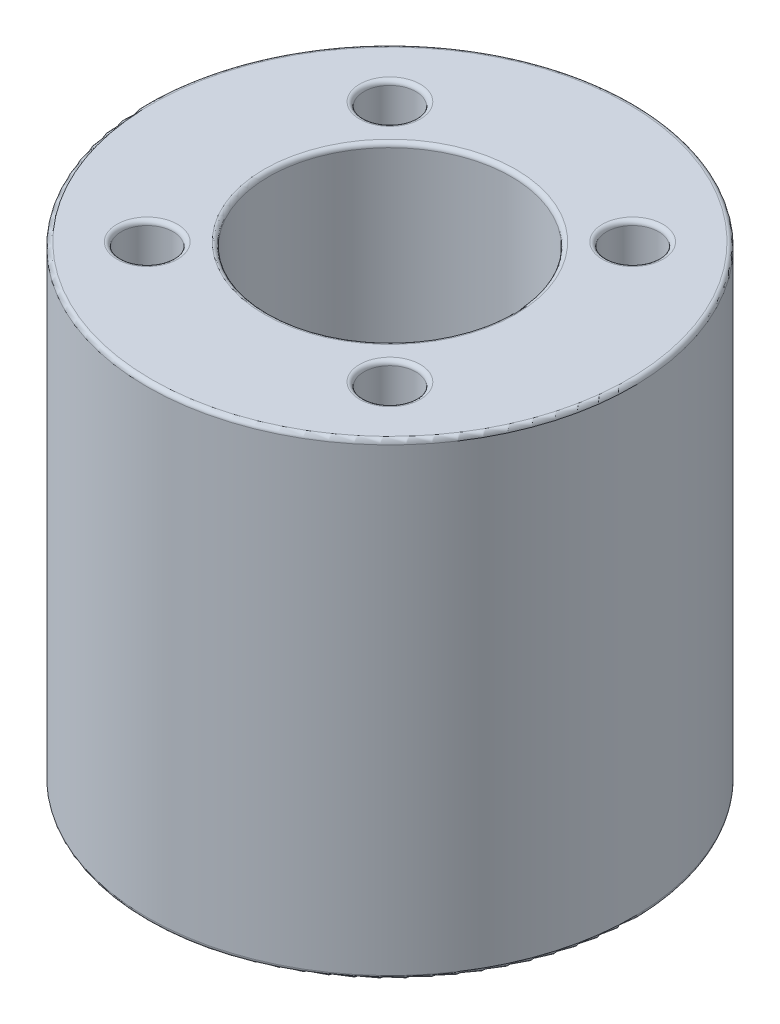
ISO-10303-21;
HEADER;
FILE_DESCRIPTION(('STEP AP214'),'2;1');
FILE_NAME('part.step','',(''),(''),'','','');
FILE_SCHEMA(('AUTOMOTIVE_DESIGN { 1 0 10303 214 1 1 1 1 }'));
ENDSEC;
DATA;
#1=APPLICATION_CONTEXT('core data for automotive mechanical design processes');
#2=APPLICATION_PROTOCOL_DEFINITION('international standard','automotive_design',2000,#1);
#3=PRODUCT_CONTEXT('',#1,'mechanical');
#4=PRODUCT('Part','Part','',(#3));
#5=PRODUCT_RELATED_PRODUCT_CATEGORY('part','',(#4));
#6=PRODUCT_DEFINITION_FORMATION('','',#4);
#7=PRODUCT_DEFINITION_CONTEXT('part definition',#1,'design');
#8=PRODUCT_DEFINITION('design','',#6,#7);
#9=PRODUCT_DEFINITION_SHAPE('','',#8);
#10=(LENGTH_UNIT() NAMED_UNIT(*) SI_UNIT(.MILLI.,.METRE.));
#11=(NAMED_UNIT(*) PLANE_ANGLE_UNIT() SI_UNIT($,.RADIAN.));
#12=(NAMED_UNIT(*) SI_UNIT($,.STERADIAN.) SOLID_ANGLE_UNIT());
#13=UNCERTAINTY_MEASURE_WITH_UNIT(LENGTH_MEASURE(1.E-05),#10,'distance_accuracy_value','');
#14=(GEOMETRIC_REPRESENTATION_CONTEXT(3) GLOBAL_UNCERTAINTY_ASSIGNED_CONTEXT((#13)) GLOBAL_UNIT_ASSIGNED_CONTEXT((#10,
#11,#12)) REPRESENTATION_CONTEXT('',''));
#15=CARTESIAN_POINT('',(0.,0.,0.));
#16=DIRECTION('',(0.,0.,1.));
#17=DIRECTION('',(1.,0.,0.));
#18=AXIS2_PLACEMENT_3D('',#15,#16,#17);
#19=CARTESIAN_POINT('',(0.,0.,0.));
#20=DIRECTION('',(0.,1.,0.));
#21=DIRECTION('',(0.,0.,1.));
#22=AXIS2_PLACEMENT_3D('',#19,#20,#21);
#23=CYLINDRICAL_SURFACE('',#22,4.);
#24=CARTESIAN_POINT('',(0.,14.75,0.));
#25=DIRECTION('',(0.,1.,0.));
#26=DIRECTION('',(0.,0.,1.));
#27=AXIS2_PLACEMENT_3D('',#24,#25,#26);
#28=CIRCLE('',#27,4.);
#29=CARTESIAN_POINT('',(0.,14.75,4.));
#30=VERTEX_POINT('',#29);
#31=EDGE_CURVE('E93',#30,#30,#28,.T.);
#32=ORIENTED_EDGE('',*,*,#31,.T.);
#33=EDGE_LOOP('',(#32));
#34=FACE_BOUND('',#33,.T.);
#35=CARTESIAN_POINT('',(0.,0.25,0.));
#36=DIRECTION('',(0.,1.,0.));
#37=DIRECTION('',(0.,0.,1.));
#38=AXIS2_PLACEMENT_3D('',#35,#36,#37);
#39=CIRCLE('',#38,4.);
#40=CARTESIAN_POINT('',(0.,0.25,4.));
#41=VERTEX_POINT('',#40);
#42=EDGE_CURVE('E96',#41,#41,#39,.F.);
#43=ORIENTED_EDGE('',*,*,#42,.T.);
#44=EDGE_LOOP('',(#43));
#45=FACE_BOUND('',#44,.T.);
#46=ADVANCED_FACE('F37',(#34,#45),#23,.F.);
#47=CARTESIAN_POINT('',(0.,27.,0.));
#48=DIRECTION('',(0.,-1.,0.));
#49=DIRECTION('',(0.,0.,-1.));
#50=AXIS2_PLACEMENT_3D('',#47,#48,#49);
#51=CYLINDRICAL_SURFACE('',#50,14.);
#52=CARTESIAN_POINT('',(0.,0.25,0.));
#53=DIRECTION('',(0.,1.,0.));
#54=DIRECTION('',(0.,0.,1.));
#55=AXIS2_PLACEMENT_3D('',#52,#53,#54);
#56=CIRCLE('',#55,14.);
#57=CARTESIAN_POINT('',(0.,0.25,14.));
#58=VERTEX_POINT('',#57);
#59=EDGE_CURVE('E111',#58,#58,#56,.T.);
#60=ORIENTED_EDGE('',*,*,#59,.T.);
#61=EDGE_LOOP('',(#60));
#62=FACE_BOUND('',#61,.T.);
#63=CARTESIAN_POINT('',(0.,26.75,0.));
#64=DIRECTION('',(0.,1.,0.));
#65=DIRECTION('',(0.,0.,1.));
#66=AXIS2_PLACEMENT_3D('',#63,#64,#65);
#67=CIRCLE('',#66,14.);
#68=CARTESIAN_POINT('',(0.,26.75,14.));
#69=VERTEX_POINT('',#68);
#70=EDGE_CURVE('E114',#69,#69,#67,.F.);
#71=ORIENTED_EDGE('',*,*,#70,.T.);
#72=EDGE_LOOP('',(#71));
#73=FACE_BOUND('',#72,.T.);
#74=ADVANCED_FACE('F159',(#62,#73),#51,.T.);
#75=CARTESIAN_POINT('',(0.,27.,0.));
#76=DIRECTION('',(0.,1.,0.));
#77=DIRECTION('',(0.,0.,1.));
#78=AXIS2_PLACEMENT_3D('',#75,#76,#77);
#79=PLANE('',#78);
#80=CARTESIAN_POINT('',(7.,27.,-7.));
#81=DIRECTION('',(0.,1.,0.));
#82=DIRECTION('',(0.,0.,1.));
#83=AXIS2_PLACEMENT_3D('',#80,#81,#82);
#84=CIRCLE('',#83,1.75);
#85=CARTESIAN_POINT('',(7.,27.,-5.25));
#86=VERTEX_POINT('',#85);
#87=EDGE_CURVE('E10',#86,#86,#84,.F.);
#88=ORIENTED_EDGE('',*,*,#87,.T.);
#89=EDGE_LOOP('',(#88));
#90=FACE_BOUND('',#89,.T.);
#91=CARTESIAN_POINT('',(7.,27.,7.));
#92=DIRECTION('',(0.,1.,0.));
#93=DIRECTION('',(0.,0.,1.));
#94=AXIS2_PLACEMENT_3D('',#91,#92,#93);
#95=CIRCLE('',#94,1.75);
#96=CARTESIAN_POINT('',(7.,27.,8.75));
#97=VERTEX_POINT('',#96);
#98=EDGE_CURVE('E44',#97,#97,#95,.F.);
#99=ORIENTED_EDGE('',*,*,#98,.T.);
#100=EDGE_LOOP('',(#99));
#101=FACE_BOUND('',#100,.T.);
#102=CARTESIAN_POINT('',(-7.,27.,7.));
#103=DIRECTION('',(0.,1.,0.));
#104=DIRECTION('',(0.,0.,1.));
#105=AXIS2_PLACEMENT_3D('',#102,#103,#104);
#106=CIRCLE('',#105,1.75);
#107=CARTESIAN_POINT('',(-7.,27.,8.75));
#108=VERTEX_POINT('',#107);
#109=EDGE_CURVE('E48',#108,#108,#106,.F.);
#110=ORIENTED_EDGE('',*,*,#109,.T.);
#111=EDGE_LOOP('',(#110));
#112=FACE_BOUND('',#111,.T.);
#113=CARTESIAN_POINT('',(-7.,27.,-7.));
#114=DIRECTION('',(0.,1.,0.));
#115=DIRECTION('',(0.,0.,1.));
#116=AXIS2_PLACEMENT_3D('',#113,#114,#115);
#117=CIRCLE('',#116,1.75);
#118=CARTESIAN_POINT('',(-7.,27.,-5.25));
#119=VERTEX_POINT('',#118);
#120=EDGE_CURVE('E52',#119,#119,#117,.F.);
#121=ORIENTED_EDGE('',*,*,#120,.T.);
#122=EDGE_LOOP('',(#121));
#123=FACE_BOUND('',#122,.T.);
#124=CARTESIAN_POINT('',(0.,27.,0.));
#125=DIRECTION('',(0.,1.,0.));
#126=DIRECTION('',(0.,0.,1.));
#127=AXIS2_PLACEMENT_3D('',#124,#125,#126);
#128=CIRCLE('',#127,7.25);
#129=CARTESIAN_POINT('',(0.,27.,7.25));
#130=VERTEX_POINT('',#129);
#131=EDGE_CURVE('E117',#130,#130,#128,.F.);
#132=ORIENTED_EDGE('',*,*,#131,.T.);
#133=EDGE_LOOP('',(#132));
#134=FACE_BOUND('',#133,.T.);
#135=CARTESIAN_POINT('',(0.,27.,0.));
#136=DIRECTION('',(0.,1.,0.));
#137=DIRECTION('',(0.,0.,1.));
#138=AXIS2_PLACEMENT_3D('',#135,#136,#137);
#139=CIRCLE('',#138,13.75);
#140=CARTESIAN_POINT('',(0.,27.,13.75));
#141=VERTEX_POINT('',#140);
#142=EDGE_CURVE('E120',#141,#141,#139,.T.);
#143=ORIENTED_EDGE('',*,*,#142,.T.);
#144=EDGE_LOOP('',(#143));
#145=FACE_BOUND('',#144,.T.);
#146=ADVANCED_FACE('F165',(#90,#101,#112,#123,#134,#145),#79,.T.);
#147=CARTESIAN_POINT('',(0.,0.,0.));
#148=DIRECTION('',(0.,1.,0.));
#149=DIRECTION('',(0.,0.,1.));
#150=AXIS2_PLACEMENT_3D('',#147,#148,#149);
#151=PLANE('',#150);
#152=CARTESIAN_POINT('',(0.,0.,0.));
#153=DIRECTION('',(0.,1.,0.));
#154=DIRECTION('',(0.,0.,1.));
#155=AXIS2_PLACEMENT_3D('',#152,#153,#154);
#156=CIRCLE('',#155,13.75);
#157=CARTESIAN_POINT('',(0.,0.,13.75));
#158=VERTEX_POINT('',#157);
#159=EDGE_CURVE('E105',#158,#158,#156,.F.);
#160=ORIENTED_EDGE('',*,*,#159,.T.);
#161=EDGE_LOOP('',(#160));
#162=FACE_BOUND('',#161,.T.);
#163=CARTESIAN_POINT('',(0.,0.,0.));
#164=DIRECTION('',(0.,1.,0.));
#165=DIRECTION('',(0.,0.,1.));
#166=AXIS2_PLACEMENT_3D('',#163,#164,#165);
#167=CIRCLE('',#166,4.25);
#168=CARTESIAN_POINT('',(0.,0.,4.25));
#169=VERTEX_POINT('',#168);
#170=EDGE_CURVE('E108',#169,#169,#167,.T.);
#171=ORIENTED_EDGE('',*,*,#170,.T.);
#172=EDGE_LOOP('',(#171));
#173=FACE_BOUND('',#172,.T.);
#174=ADVANCED_FACE('F143',(#162,#173),#151,.F.);
#175=CARTESIAN_POINT('',(0.,15.,0.));
#176=DIRECTION('',(0.,1.,0.));
#177=DIRECTION('',(0.,0.,1.));
#178=AXIS2_PLACEMENT_3D('',#175,#176,#177);
#179=PLANE('',#178);
#180=CARTESIAN_POINT('',(0.,15.,0.));
#181=DIRECTION('',(0.,1.,0.));
#182=DIRECTION('',(0.,0.,1.));
#183=AXIS2_PLACEMENT_3D('',#180,#181,#182);
#184=CIRCLE('',#183,6.75);
#185=CARTESIAN_POINT('',(0.,15.,6.75));
#186=VERTEX_POINT('',#185);
#187=EDGE_CURVE('E99',#186,#186,#184,.T.);
#188=ORIENTED_EDGE('',*,*,#187,.T.);
#189=EDGE_LOOP('',(#188));
#190=FACE_BOUND('',#189,.T.);
#191=CARTESIAN_POINT('',(0.,15.,0.));
#192=DIRECTION('',(0.,1.,0.));
#193=DIRECTION('',(0.,0.,1.));
#194=AXIS2_PLACEMENT_3D('',#191,#192,#193);
#195=CIRCLE('',#194,4.25);
#196=CARTESIAN_POINT('',(0.,15.,4.25));
#197=VERTEX_POINT('',#196);
#198=EDGE_CURVE('E102',#197,#197,#195,.F.);
#199=ORIENTED_EDGE('',*,*,#198,.T.);
#200=EDGE_LOOP('',(#199));
#201=FACE_BOUND('',#200,.T.);
#202=ADVANCED_FACE('F140',(#190,#201),#179,.T.);
#203=CARTESIAN_POINT('',(0.,15.,0.));
#204=DIRECTION('',(0.,1.,0.));
#205=DIRECTION('',(0.,0.,1.));
#206=AXIS2_PLACEMENT_3D('',#203,#204,#205);
#207=CYLINDRICAL_SURFACE('',#206,7.);
#208=CARTESIAN_POINT('',(0.,26.75,0.));
#209=DIRECTION('',(0.,1.,0.));
#210=DIRECTION('',(0.,0.,1.));
#211=AXIS2_PLACEMENT_3D('',#208,#209,#210);
#212=CIRCLE('',#211,7.);
#213=CARTESIAN_POINT('',(0.,26.75,7.));
#214=VERTEX_POINT('',#213);
#215=EDGE_CURVE('E123',#214,#214,#212,.T.);
#216=ORIENTED_EDGE('',*,*,#215,.T.);
#217=EDGE_LOOP('',(#216));
#218=FACE_BOUND('',#217,.T.);
#219=CARTESIAN_POINT('',(0.,15.25,0.));
#220=DIRECTION('',(0.,1.,0.));
#221=DIRECTION('',(0.,0.,1.));
#222=AXIS2_PLACEMENT_3D('',#219,#220,#221);
#223=CIRCLE('',#222,7.);
#224=CARTESIAN_POINT('',(0.,15.25,7.));
#225=VERTEX_POINT('',#224);
#226=EDGE_CURVE('E126',#225,#225,#223,.F.);
#227=ORIENTED_EDGE('',*,*,#226,.T.);
#228=EDGE_LOOP('',(#227));
#229=FACE_BOUND('',#228,.T.);
#230=ADVANCED_FACE('F130',(#218,#229),#207,.F.);
#231=CARTESIAN_POINT('',(0.,26.75,0.));
#232=DIRECTION('',(0.,1.,0.));
#233=DIRECTION('',(0.,0.,1.));
#234=AXIS2_PLACEMENT_3D('',#231,#232,#233);
#235=TOROIDAL_SURFACE('',#234,7.25,0.25);
#236=ORIENTED_EDGE('',*,*,#131,.F.);
#237=EDGE_LOOP('',(#236));
#238=FACE_BOUND('',#237,.T.);
#239=ORIENTED_EDGE('',*,*,#215,.F.);
#240=EDGE_LOOP('',(#239));
#241=FACE_BOUND('',#240,.T.);
#242=ADVANCED_FACE('F176',(#238,#241),#235,.T.);
#243=CARTESIAN_POINT('',(0.,0.25,0.));
#244=DIRECTION('',(0.,1.,0.));
#245=DIRECTION('',(0.,0.,1.));
#246=AXIS2_PLACEMENT_3D('',#243,#244,#245);
#247=TOROIDAL_SURFACE('',#246,13.75,0.25);
#248=ORIENTED_EDGE('',*,*,#159,.F.);
#249=EDGE_LOOP('',(#248));
#250=FACE_BOUND('',#249,.T.);
#251=ORIENTED_EDGE('',*,*,#59,.F.);
#252=EDGE_LOOP('',(#251));
#253=FACE_BOUND('',#252,.T.);
#254=ADVANCED_FACE('F136',(#250,#253),#247,.T.);
#255=CARTESIAN_POINT('',(0.,15.25,0.));
#256=DIRECTION('',(0.,1.,0.));
#257=DIRECTION('',(0.,0.,1.));
#258=AXIS2_PLACEMENT_3D('',#255,#256,#257);
#259=TOROIDAL_SURFACE('',#258,6.75,0.25);
#260=ORIENTED_EDGE('',*,*,#226,.F.);
#261=EDGE_LOOP('',(#260));
#262=FACE_BOUND('',#261,.T.);
#263=ORIENTED_EDGE('',*,*,#187,.F.);
#264=EDGE_LOOP('',(#263));
#265=FACE_BOUND('',#264,.T.);
#266=ADVANCED_FACE('F132',(#262,#265),#259,.F.);
#267=CARTESIAN_POINT('',(0.,14.75,0.));
#268=DIRECTION('',(0.,1.,0.));
#269=DIRECTION('',(0.,0.,1.));
#270=AXIS2_PLACEMENT_3D('',#267,#268,#269);
#271=TOROIDAL_SURFACE('',#270,4.25,0.25);
#272=ORIENTED_EDGE('',*,*,#31,.F.);
#273=EDGE_LOOP('',(#272));
#274=FACE_BOUND('',#273,.T.);
#275=ORIENTED_EDGE('',*,*,#198,.F.);
#276=EDGE_LOOP('',(#275));
#277=FACE_BOUND('',#276,.T.);
#278=ADVANCED_FACE('F135',(#274,#277),#271,.T.);
#279=CARTESIAN_POINT('',(0.,0.25,0.));
#280=DIRECTION('',(0.,1.,0.));
#281=DIRECTION('',(0.,0.,1.));
#282=AXIS2_PLACEMENT_3D('',#279,#280,#281);
#283=TOROIDAL_SURFACE('',#282,4.25,0.25);
#284=ORIENTED_EDGE('',*,*,#42,.F.);
#285=EDGE_LOOP('',(#284));
#286=FACE_BOUND('',#285,.T.);
#287=ORIENTED_EDGE('',*,*,#170,.F.);
#288=EDGE_LOOP('',(#287));
#289=FACE_BOUND('',#288,.T.);
#290=ADVANCED_FACE('F148',(#286,#289),#283,.T.);
#291=CARTESIAN_POINT('',(0.,26.75,0.));
#292=DIRECTION('',(0.,1.,0.));
#293=DIRECTION('',(0.,0.,1.));
#294=AXIS2_PLACEMENT_3D('',#291,#292,#293);
#295=TOROIDAL_SURFACE('',#294,13.75,0.25);
#296=ORIENTED_EDGE('',*,*,#70,.F.);
#297=EDGE_LOOP('',(#296));
#298=FACE_BOUND('',#297,.T.);
#299=ORIENTED_EDGE('',*,*,#142,.F.);
#300=EDGE_LOOP('',(#299));
#301=FACE_BOUND('',#300,.T.);
#302=ADVANCED_FACE('F154',(#298,#301),#295,.T.);
#303=CARTESIAN_POINT('',(-7.,21.5,-7.));
#304=DIRECTION('',(0.,1.,0.));
#305=DIRECTION('',(0.,0.,1.));
#306=AXIS2_PLACEMENT_3D('',#303,#304,#305);
#307=CYLINDRICAL_SURFACE('',#306,1.5);
#308=CARTESIAN_POINT('',(-7.,21.75,-7.));
#309=DIRECTION('',(0.,1.,0.));
#310=DIRECTION('',(0.,0.,1.));
#311=AXIS2_PLACEMENT_3D('',#308,#309,#310);
#312=CIRCLE('',#311,1.5);
#313=CARTESIAN_POINT('',(-7.,21.75,-5.5));
#314=VERTEX_POINT('',#313);
#315=EDGE_CURVE('E57',#314,#314,#312,.F.);
#316=ORIENTED_EDGE('',*,*,#315,.T.);
#317=EDGE_LOOP('',(#316));
#318=FACE_BOUND('',#317,.T.);
#319=CARTESIAN_POINT('',(-7.,26.75,-7.));
#320=DIRECTION('',(0.,1.,0.));
#321=DIRECTION('',(0.,0.,1.));
#322=AXIS2_PLACEMENT_3D('',#319,#320,#321);
#323=CIRCLE('',#322,1.5);
#324=CARTESIAN_POINT('',(-7.,26.75,-5.5));
#325=VERTEX_POINT('',#324);
#326=EDGE_CURVE('E60',#325,#325,#323,.T.);
#327=ORIENTED_EDGE('',*,*,#326,.T.);
#328=EDGE_LOOP('',(#327));
#329=FACE_BOUND('',#328,.T.);
#330=ADVANCED_FACE('F192',(#318,#329),#307,.F.);
#331=CARTESIAN_POINT('',(-7.,21.5,-7.));
#332=DIRECTION('',(0.,1.,0.));
#333=DIRECTION('',(0.,0.,1.));
#334=AXIS2_PLACEMENT_3D('',#331,#332,#333);
#335=PLANE('',#334);
#336=CARTESIAN_POINT('',(-7.,21.5,-7.));
#337=DIRECTION('',(0.,1.,0.));
#338=DIRECTION('',(0.,0.,1.));
#339=AXIS2_PLACEMENT_3D('',#336,#337,#338);
#340=CIRCLE('',#339,1.25);
#341=CARTESIAN_POINT('',(-7.,21.5,-5.75));
#342=VERTEX_POINT('',#341);
#343=EDGE_CURVE('E63',#342,#342,#340,.T.);
#344=ORIENTED_EDGE('',*,*,#343,.T.);
#345=EDGE_LOOP('',(#344));
#346=FACE_BOUND('',#345,.T.);
#347=ADVANCED_FACE('F199',(#346),#335,.T.);
#348=CARTESIAN_POINT('',(7.,21.5,7.));
#349=DIRECTION('',(0.,1.,0.));
#350=DIRECTION('',(0.,0.,1.));
#351=AXIS2_PLACEMENT_3D('',#348,#349,#350);
#352=CYLINDRICAL_SURFACE('',#351,1.5);
#353=CARTESIAN_POINT('',(7.,21.75,7.));
#354=DIRECTION('',(0.,1.,0.));
#355=DIRECTION('',(0.,0.,1.));
#356=AXIS2_PLACEMENT_3D('',#353,#354,#355);
#357=CIRCLE('',#356,1.5);
#358=CARTESIAN_POINT('',(7.,21.75,8.5));
#359=VERTEX_POINT('',#358);
#360=EDGE_CURVE('E75',#359,#359,#357,.F.);
#361=ORIENTED_EDGE('',*,*,#360,.T.);
#362=EDGE_LOOP('',(#361));
#363=FACE_BOUND('',#362,.T.);
#364=CARTESIAN_POINT('',(7.,26.75,7.));
#365=DIRECTION('',(0.,1.,0.));
#366=DIRECTION('',(0.,0.,1.));
#367=AXIS2_PLACEMENT_3D('',#364,#365,#366);
#368=CIRCLE('',#367,1.5);
#369=CARTESIAN_POINT('',(7.,26.75,8.5));
#370=VERTEX_POINT('',#369);
#371=EDGE_CURVE('E78',#370,#370,#368,.T.);
#372=ORIENTED_EDGE('',*,*,#371,.T.);
#373=EDGE_LOOP('',(#372));
#374=FACE_BOUND('',#373,.T.);
#375=ADVANCED_FACE('F251',(#363,#374),#352,.F.);
#376=CARTESIAN_POINT('',(7.,21.5,7.));
#377=DIRECTION('',(0.,1.,0.));
#378=DIRECTION('',(0.,0.,1.));
#379=AXIS2_PLACEMENT_3D('',#376,#377,#378);
#380=PLANE('',#379);
#381=CARTESIAN_POINT('',(7.,21.5,7.));
#382=DIRECTION('',(0.,1.,0.));
#383=DIRECTION('',(0.,0.,1.));
#384=AXIS2_PLACEMENT_3D('',#381,#382,#383);
#385=CIRCLE('',#384,1.25);
#386=CARTESIAN_POINT('',(7.,21.5,8.25));
#387=VERTEX_POINT('',#386);
#388=EDGE_CURVE('E81',#387,#387,#385,.T.);
#389=ORIENTED_EDGE('',*,*,#388,.T.);
#390=EDGE_LOOP('',(#389));
#391=FACE_BOUND('',#390,.T.);
#392=ADVANCED_FACE('F241',(#391),#380,.T.);
#393=CARTESIAN_POINT('',(-7.,21.5,7.));
#394=DIRECTION('',(0.,1.,0.));
#395=DIRECTION('',(0.,0.,1.));
#396=AXIS2_PLACEMENT_3D('',#393,#394,#395);
#397=CYLINDRICAL_SURFACE('',#396,1.5);
#398=CARTESIAN_POINT('',(-7.,21.75,7.));
#399=DIRECTION('',(0.,1.,0.));
#400=DIRECTION('',(0.,0.,1.));
#401=AXIS2_PLACEMENT_3D('',#398,#399,#400);
#402=CIRCLE('',#401,1.5);
#403=CARTESIAN_POINT('',(-7.,21.75,8.5));
#404=VERTEX_POINT('',#403);
#405=EDGE_CURVE('E66',#404,#404,#402,.F.);
#406=ORIENTED_EDGE('',*,*,#405,.T.);
#407=EDGE_LOOP('',(#406));
#408=FACE_BOUND('',#407,.T.);
#409=CARTESIAN_POINT('',(-7.,26.75,7.));
#410=DIRECTION('',(0.,1.,0.));
#411=DIRECTION('',(0.,0.,1.));
#412=AXIS2_PLACEMENT_3D('',#409,#410,#411);
#413=CIRCLE('',#412,1.5);
#414=CARTESIAN_POINT('',(-7.,26.75,8.5));
#415=VERTEX_POINT('',#414);
#416=EDGE_CURVE('E69',#415,#415,#413,.T.);
#417=ORIENTED_EDGE('',*,*,#416,.T.);
#418=EDGE_LOOP('',(#417));
#419=FACE_BOUND('',#418,.T.);
#420=ADVANCED_FACE('F238',(#408,#419),#397,.F.);
#421=CARTESIAN_POINT('',(-7.,21.5,7.));
#422=DIRECTION('',(0.,1.,0.));
#423=DIRECTION('',(0.,0.,1.));
#424=AXIS2_PLACEMENT_3D('',#421,#422,#423);
#425=PLANE('',#424);
#426=CARTESIAN_POINT('',(-7.,21.5,7.));
#427=DIRECTION('',(0.,1.,0.));
#428=DIRECTION('',(0.,0.,1.));
#429=AXIS2_PLACEMENT_3D('',#426,#427,#428);
#430=CIRCLE('',#429,1.25);
#431=CARTESIAN_POINT('',(-7.,21.5,8.25));
#432=VERTEX_POINT('',#431);
#433=EDGE_CURVE('E72',#432,#432,#430,.T.);
#434=ORIENTED_EDGE('',*,*,#433,.T.);
#435=EDGE_LOOP('',(#434));
#436=FACE_BOUND('',#435,.T.);
#437=ADVANCED_FACE('F240',(#436),#425,.T.);
#438=CARTESIAN_POINT('',(7.,21.5,-7.));
#439=DIRECTION('',(0.,1.,0.));
#440=DIRECTION('',(0.,0.,1.));
#441=AXIS2_PLACEMENT_3D('',#438,#439,#440);
#442=CYLINDRICAL_SURFACE('',#441,1.5);
#443=CARTESIAN_POINT('',(7.,21.75,-7.));
#444=DIRECTION('',(0.,1.,0.));
#445=DIRECTION('',(0.,0.,1.));
#446=AXIS2_PLACEMENT_3D('',#443,#444,#445);
#447=CIRCLE('',#446,1.5);
#448=CARTESIAN_POINT('',(7.,21.75,-5.5));
#449=VERTEX_POINT('',#448);
#450=EDGE_CURVE('E84',#449,#449,#447,.F.);
#451=ORIENTED_EDGE('',*,*,#450,.T.);
#452=EDGE_LOOP('',(#451));
#453=FACE_BOUND('',#452,.T.);
#454=CARTESIAN_POINT('',(7.,26.75,-7.));
#455=DIRECTION('',(0.,1.,0.));
#456=DIRECTION('',(0.,0.,1.));
#457=AXIS2_PLACEMENT_3D('',#454,#455,#456);
#458=CIRCLE('',#457,1.5);
#459=CARTESIAN_POINT('',(7.,26.75,-5.5));
#460=VERTEX_POINT('',#459);
#461=EDGE_CURVE('E87',#460,#460,#458,.T.);
#462=ORIENTED_EDGE('',*,*,#461,.T.);
#463=EDGE_LOOP('',(#462));
#464=FACE_BOUND('',#463,.T.);
#465=ADVANCED_FACE('F248',(#453,#464),#442,.F.);
#466=CARTESIAN_POINT('',(7.,21.5,-7.));
#467=DIRECTION('',(0.,1.,0.));
#468=DIRECTION('',(0.,0.,1.));
#469=AXIS2_PLACEMENT_3D('',#466,#467,#468);
#470=PLANE('',#469);
#471=CARTESIAN_POINT('',(7.,21.5,-7.));
#472=DIRECTION('',(0.,1.,0.));
#473=DIRECTION('',(0.,0.,1.));
#474=AXIS2_PLACEMENT_3D('',#471,#472,#473);
#475=CIRCLE('',#474,1.25);
#476=CARTESIAN_POINT('',(7.,21.5,-5.75));
#477=VERTEX_POINT('',#476);
#478=EDGE_CURVE('E90',#477,#477,#475,.T.);
#479=ORIENTED_EDGE('',*,*,#478,.T.);
#480=EDGE_LOOP('',(#479));
#481=FACE_BOUND('',#480,.T.);
#482=ADVANCED_FACE('F207',(#481),#470,.T.);
#483=CARTESIAN_POINT('',(7.,21.75,-7.));
#484=DIRECTION('',(0.,1.,0.));
#485=DIRECTION('',(0.,0.,1.));
#486=AXIS2_PLACEMENT_3D('',#483,#484,#485);
#487=TOROIDAL_SURFACE('',#486,1.25,0.25);
#488=ORIENTED_EDGE('',*,*,#450,.F.);
#489=EDGE_LOOP('',(#488));
#490=FACE_BOUND('',#489,.T.);
#491=ORIENTED_EDGE('',*,*,#478,.F.);
#492=EDGE_LOOP('',(#491));
#493=FACE_BOUND('',#492,.T.);
#494=ADVANCED_FACE('F203',(#490,#493),#487,.F.);
#495=CARTESIAN_POINT('',(7.,21.75,7.));
#496=DIRECTION('',(0.,1.,0.));
#497=DIRECTION('',(0.,0.,1.));
#498=AXIS2_PLACEMENT_3D('',#495,#496,#497);
#499=TOROIDAL_SURFACE('',#498,1.25,0.25);
#500=ORIENTED_EDGE('',*,*,#360,.F.);
#501=EDGE_LOOP('',(#500));
#502=FACE_BOUND('',#501,.T.);
#503=ORIENTED_EDGE('',*,*,#388,.F.);
#504=EDGE_LOOP('',(#503));
#505=FACE_BOUND('',#504,.T.);
#506=ADVANCED_FACE('F206',(#502,#505),#499,.F.);
#507=CARTESIAN_POINT('',(-7.,21.75,7.));
#508=DIRECTION('',(0.,1.,0.));
#509=DIRECTION('',(0.,0.,1.));
#510=AXIS2_PLACEMENT_3D('',#507,#508,#509);
#511=TOROIDAL_SURFACE('',#510,1.25,0.25);
#512=ORIENTED_EDGE('',*,*,#405,.F.);
#513=EDGE_LOOP('',(#512));
#514=FACE_BOUND('',#513,.T.);
#515=ORIENTED_EDGE('',*,*,#433,.F.);
#516=EDGE_LOOP('',(#515));
#517=FACE_BOUND('',#516,.T.);
#518=ADVANCED_FACE('F211',(#514,#517),#511,.F.);
#519=CARTESIAN_POINT('',(-7.,21.75,-7.));
#520=DIRECTION('',(0.,1.,0.));
#521=DIRECTION('',(0.,0.,1.));
#522=AXIS2_PLACEMENT_3D('',#519,#520,#521);
#523=TOROIDAL_SURFACE('',#522,1.25,0.25);
#524=ORIENTED_EDGE('',*,*,#315,.F.);
#525=EDGE_LOOP('',(#524));
#526=FACE_BOUND('',#525,.T.);
#527=ORIENTED_EDGE('',*,*,#343,.F.);
#528=EDGE_LOOP('',(#527));
#529=FACE_BOUND('',#528,.T.);
#530=ADVANCED_FACE('F215',(#526,#529),#523,.F.);
#531=CARTESIAN_POINT('',(7.,26.75,-7.));
#532=DIRECTION('',(0.,1.,0.));
#533=DIRECTION('',(0.,0.,1.));
#534=AXIS2_PLACEMENT_3D('',#531,#532,#533);
#535=TOROIDAL_SURFACE('',#534,1.75,0.25);
#536=ORIENTED_EDGE('',*,*,#87,.F.);
#537=EDGE_LOOP('',(#536));
#538=FACE_BOUND('',#537,.T.);
#539=ORIENTED_EDGE('',*,*,#461,.F.);
#540=EDGE_LOOP('',(#539));
#541=FACE_BOUND('',#540,.T.);
#542=ADVANCED_FACE('F219',(#538,#541),#535,.T.);
#543=CARTESIAN_POINT('',(7.,26.75,7.));
#544=DIRECTION('',(0.,1.,0.));
#545=DIRECTION('',(0.,0.,1.));
#546=AXIS2_PLACEMENT_3D('',#543,#544,#545);
#547=TOROIDAL_SURFACE('',#546,1.75,0.25);
#548=ORIENTED_EDGE('',*,*,#98,.F.);
#549=EDGE_LOOP('',(#548));
#550=FACE_BOUND('',#549,.T.);
#551=ORIENTED_EDGE('',*,*,#371,.F.);
#552=EDGE_LOOP('',(#551));
#553=FACE_BOUND('',#552,.T.);
#554=ADVANCED_FACE('F223',(#550,#553),#547,.T.);
#555=CARTESIAN_POINT('',(-7.,26.75,7.));
#556=DIRECTION('',(0.,1.,0.));
#557=DIRECTION('',(0.,0.,1.));
#558=AXIS2_PLACEMENT_3D('',#555,#556,#557);
#559=TOROIDAL_SURFACE('',#558,1.75,0.25);
#560=ORIENTED_EDGE('',*,*,#109,.F.);
#561=EDGE_LOOP('',(#560));
#562=FACE_BOUND('',#561,.T.);
#563=ORIENTED_EDGE('',*,*,#416,.F.);
#564=EDGE_LOOP('',(#563));
#565=FACE_BOUND('',#564,.T.);
#566=ADVANCED_FACE('F226',(#562,#565),#559,.T.);
#567=CARTESIAN_POINT('',(-7.,26.75,-7.));
#568=DIRECTION('',(0.,1.,0.));
#569=DIRECTION('',(0.,0.,1.));
#570=AXIS2_PLACEMENT_3D('',#567,#568,#569);
#571=TOROIDAL_SURFACE('',#570,1.75,0.25);
#572=ORIENTED_EDGE('',*,*,#120,.F.);
#573=EDGE_LOOP('',(#572));
#574=FACE_BOUND('',#573,.T.);
#575=ORIENTED_EDGE('',*,*,#326,.F.);
#576=EDGE_LOOP('',(#575));
#577=FACE_BOUND('',#576,.T.);
#578=ADVANCED_FACE('F39',(#574,#577),#571,.T.);
#579=CLOSED_SHELL('',(#46,#74,#146,#174,#202,#230,#242,#254,#266,#278,#290,#302,#330,#347,#375,
#392,#420,#437,#465,#482,#494,#506,#518,#530,#542,#554,#566,#578));
#580=MANIFOLD_SOLID_BREP('B2',#579);
#581=ADVANCED_BREP_SHAPE_REPRESENTATION('',(#18,#580),#14);
#582=SHAPE_DEFINITION_REPRESENTATION(#9,#581);
ENDSEC;
END-ISO-10303-21;
